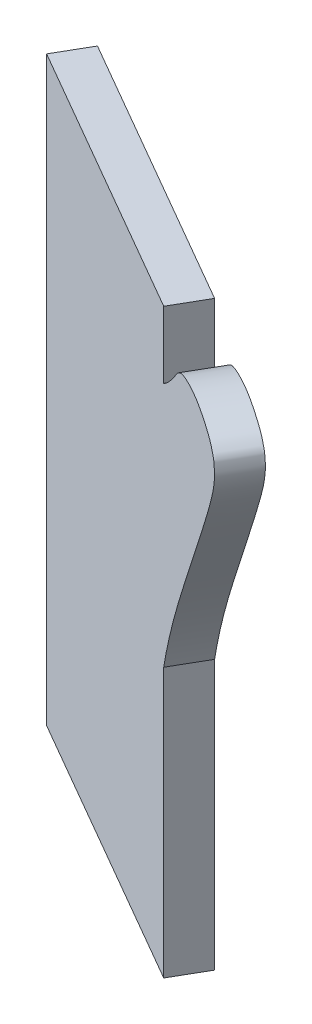
ISO-10303-21;
HEADER;
FILE_DESCRIPTION(('STEP AP214'),'2;1');
FILE_NAME('part.step','',(''),(''),'','','');
FILE_SCHEMA(('AUTOMOTIVE_DESIGN { 1 0 10303 214 1 1 1 1 }'));
ENDSEC;
DATA;
#1=APPLICATION_CONTEXT('core data for automotive mechanical design processes');
#2=APPLICATION_PROTOCOL_DEFINITION('international standard','automotive_design',2000,#1);
#3=PRODUCT_CONTEXT('',#1,'mechanical');
#4=PRODUCT('Part','Part','',(#3));
#5=PRODUCT_RELATED_PRODUCT_CATEGORY('part','',(#4));
#6=PRODUCT_DEFINITION_FORMATION('','',#4);
#7=PRODUCT_DEFINITION_CONTEXT('part definition',#1,'design');
#8=PRODUCT_DEFINITION('design','',#6,#7);
#9=PRODUCT_DEFINITION_SHAPE('','',#8);
#10=(LENGTH_UNIT() NAMED_UNIT(*) SI_UNIT(.MILLI.,.METRE.));
#11=(NAMED_UNIT(*) PLANE_ANGLE_UNIT() SI_UNIT($,.RADIAN.));
#12=(NAMED_UNIT(*) SI_UNIT($,.STERADIAN.) SOLID_ANGLE_UNIT());
#13=UNCERTAINTY_MEASURE_WITH_UNIT(LENGTH_MEASURE(1.E-05),#10,'distance_accuracy_value','');
#14=(GEOMETRIC_REPRESENTATION_CONTEXT(3) GLOBAL_UNCERTAINTY_ASSIGNED_CONTEXT((#13)) GLOBAL_UNIT_ASSIGNED_CONTEXT((#10,
#11,#12)) REPRESENTATION_CONTEXT('',''));
#15=CARTESIAN_POINT('',(0.,0.,0.));
#16=DIRECTION('',(0.,0.,1.));
#17=DIRECTION('',(1.,0.,0.));
#18=AXIS2_PLACEMENT_3D('',#15,#16,#17);
#19=CARTESIAN_POINT('',(7.80159971962486,1.25599999999999,13.9842601094867));
#20=DIRECTION('',(0.866024507379608,0.,0.500001552615496));
#21=DIRECTION('',(0.500001552615496,0.,-0.866024507379608));
#22=AXIS2_PLACEMENT_3D('',#19,#20,#21);
#23=PLANE('',#22);
#24=DIRECTION('',(0.,-1.,0.));
#25=VECTOR('',#24,1.);
#26=CARTESIAN_POINT('',(11.8016121405488,1.25599999999999,7.05606405044984));
#27=LINE('',#26,#25);
#28=CARTESIAN_POINT('',(11.8016121405488,1.25599999999999,7.05606405044984));
#29=VERTEX_POINT('',#28);
#30=CARTESIAN_POINT('',(11.8016121405488,-123.736,7.05606405044984));
#31=VERTEX_POINT('',#30);
#32=EDGE_CURVE('E151',#29,#31,#27,.T.);
#33=ORIENTED_EDGE('',*,*,#32,.T.);
#34=DIRECTION('',(0.500001552615496,0.,-0.866024507379608));
#35=VECTOR('',#34,1.);
#36=CARTESIAN_POINT('',(7.80159971962486,-123.736,13.9842601094867));
#37=LINE('',#36,#35);
#38=CARTESIAN_POINT('',(7.80159971962486,-123.736,13.9842601094867));
#39=VERTEX_POINT('',#38);
#40=EDGE_CURVE('E11',#39,#31,#37,.T.);
#41=ORIENTED_EDGE('',*,*,#40,.F.);
#42=DIRECTION('',(0.,-1.,0.));
#43=VECTOR('',#42,1.);
#44=CARTESIAN_POINT('',(7.80159971962486,1.25599999999999,13.9842601094867));
#45=LINE('',#44,#43);
#46=CARTESIAN_POINT('',(7.80159971962486,1.25599999999999,13.9842601094867));
#47=VERTEX_POINT('',#46);
#48=EDGE_CURVE('E158',#47,#39,#45,.T.);
#49=ORIENTED_EDGE('',*,*,#48,.F.);
#50=DIRECTION('',(0.500001552615496,0.,-0.866024507379608));
#51=VECTOR('',#50,1.);
#52=CARTESIAN_POINT('',(7.80159971962486,1.25599999999999,13.9842601094867));
#53=LINE('',#52,#51);
#54=EDGE_CURVE('E116',#47,#29,#53,.T.);
#55=ORIENTED_EDGE('',*,*,#54,.T.);
#56=EDGE_LOOP('',(#33,#41,#49,#55));
#57=FACE_BOUND('',#56,.T.);
#58=ADVANCED_FACE('F31',(#57),#23,.F.);
#59=CARTESIAN_POINT('',(7.80159971962486,-123.736,13.9842601094867));
#60=DIRECTION('',(0.,1.,0.));
#61=DIRECTION('',(-1.,0.,0.));
#62=AXIS2_PLACEMENT_3D('',#59,#60,#61);
#63=PLANE('',#62);
#64=DIRECTION('',(0.866024507379608,0.,0.500001552615496));
#65=VECTOR('',#64,1.);
#66=CARTESIAN_POINT('',(11.8016121405488,-123.736,7.05606405044984));
#67=LINE('',#66,#65);
#68=CARTESIAN_POINT('',(71.3416946420887,-123.736,41.4316890355929));
#69=VERTEX_POINT('',#68);
#70=EDGE_CURVE('E154',#31,#69,#67,.T.);
#71=ORIENTED_EDGE('',*,*,#70,.T.);
#72=DIRECTION('',(0.500001552615496,0.,-0.866024507379608));
#73=VECTOR('',#72,1.);
#74=CARTESIAN_POINT('',(67.3416822211648,-123.736,48.3598850946298));
#75=LINE('',#74,#73);
#76=CARTESIAN_POINT('',(67.3416822211648,-123.736,48.3598850946298));
#77=VERTEX_POINT('',#76);
#78=EDGE_CURVE('E40',#77,#69,#75,.T.);
#79=ORIENTED_EDGE('',*,*,#78,.F.);
#80=DIRECTION('',(0.866024507379608,0.,0.500001552615496));
#81=VECTOR('',#80,1.);
#82=CARTESIAN_POINT('',(7.80159971962486,-123.736,13.9842601094867));
#83=LINE('',#82,#81);
#84=EDGE_CURVE('E86',#39,#77,#83,.T.);
#85=ORIENTED_EDGE('',*,*,#84,.F.);
#86=ORIENTED_EDGE('',*,*,#40,.T.);
#87=EDGE_LOOP('',(#71,#79,#85,#86));
#88=FACE_BOUND('',#87,.T.);
#89=ADVANCED_FACE('F212',(#88),#63,.F.);
#90=CARTESIAN_POINT('',(67.3416822211648,-123.736,48.3598850946298));
#91=DIRECTION('',(-0.866024507379608,3.39362587450117E-08,-0.500001552615496));
#92=DIRECTION('',(-0.500001552615496,0.,0.866024507379608));
#93=AXIS2_PLACEMENT_3D('',#90,#91,#92);
#94=PLANE('',#93);
#95=DIRECTION('',(2.93896317663542E-08,0.999999999999999,1.69681820548487E-08));
#96=VECTOR('',#95,1.);
#97=CARTESIAN_POINT('',(71.3416946420887,-123.736,41.4316890355929));
#98=LINE('',#97,#96);
#99=CARTESIAN_POINT('',(71.3416963415527,-65.9107093126962,41.431690016783));
#100=VERTEX_POINT('',#99);
#101=EDGE_CURVE('E156',#69,#100,#98,.T.);
#102=ORIENTED_EDGE('',*,*,#101,.T.);
#103=DIRECTION('',(0.500001552615496,0.,-0.866024507379608));
#104=VECTOR('',#103,1.);
#105=CARTESIAN_POINT('',(67.3416839206288,-65.9107093126962,48.3598860758198));
#106=LINE('',#105,#104);
#107=CARTESIAN_POINT('',(67.3416839206288,-65.9107093126962,48.3598860758198));
#108=VERTEX_POINT('',#107);
#109=EDGE_CURVE('E111',#108,#100,#106,.T.);
#110=ORIENTED_EDGE('',*,*,#109,.F.);
#111=DIRECTION('',(2.93896317663542E-08,0.999999999999999,1.69681820548487E-08));
#112=VECTOR('',#111,1.);
#113=CARTESIAN_POINT('',(67.3416822211648,-123.736,48.3598850946298));
#114=LINE('',#113,#112);
#115=EDGE_CURVE('E100',#77,#108,#114,.T.);
#116=ORIENTED_EDGE('',*,*,#115,.F.);
#117=ORIENTED_EDGE('',*,*,#78,.T.);
#118=EDGE_LOOP('',(#102,#110,#116,#117));
#119=FACE_BOUND('',#118,.T.);
#120=ADVANCED_FACE('F138',(#119),#94,.F.);
#121=CARTESIAN_POINT('',(67.3416839206288,-65.9107093126962,48.3598860758198));
#122=CARTESIAN_POINT('',(67.4250185770641,-65.6443932058091,48.4079995613497));
#123=CARTESIAN_POINT('',(67.5930013691193,-65.1075634507249,48.5049848731101));
#124=CARTESIAN_POINT('',(68.1708084257599,-63.3446486646693,48.8385833139979));
#125=CARTESIAN_POINT('',(69.0687092921912,-60.8408831904544,49.3569887672903));
#126=CARTESIAN_POINT('',(70.4049351848799,-57.4996720191718,50.1284623402622));
#127=CARTESIAN_POINT('',(71.7722908958488,-54.3494689478632,50.9179087966111));
#128=CARTESIAN_POINT('',(73.7468338501138,-50.0914841697523,52.0579164227529));
#129=CARTESIAN_POINT('',(76.3406900276199,-44.9081403901387,53.5554861854592));
#130=CARTESIAN_POINT('',(79.6032484160417,-38.7227527052616,55.439132948119));
#131=CARTESIAN_POINT('',(82.9054747227887,-32.5646225699528,57.3456820889247));
#132=CARTESIAN_POINT('',(85.6331531518437,-27.4155860887233,58.9205144844765));
#133=CARTESIAN_POINT('',(87.7783477133897,-23.2713950006755,60.1590482699473));
#134=CARTESIAN_POINT('',(89.3640725882436,-20.1481312481985,61.0745707438401));
#135=CARTESIAN_POINT('',(90.6596388505885,-17.4971839357088,61.8225693710946));
#136=CARTESIAN_POINT('',(91.6227607580608,-15.3558219859797,62.378630365894));
#137=CARTESIAN_POINT('',(92.2327762733138,-13.8403301667215,62.7308244460234));
#138=CARTESIAN_POINT('',(92.6861510903478,-12.4956493595633,62.9925816024342));
#139=CARTESIAN_POINT('',(92.9799909643025,-11.3346937841033,63.1622308351588));
#140=CARTESIAN_POINT('',(93.1472288921861,-10.3048850458611,63.2587860976086));
#141=CARTESIAN_POINT('',(93.1767574542843,-9.50364877799679,63.2758344914702));
#142=CARTESIAN_POINT('',(93.099338936241,-8.90334587084222,63.2311367041756));
#143=CARTESIAN_POINT('',(93.0194461601597,-8.53695279525007,63.1850103974221));
#144=CARTESIAN_POINT('',(92.9521547733886,-8.24494472143904,63.1461595363016));
#145=CARTESIAN_POINT('',(92.9022617028213,-8.00556671763939,63.1173536393138));
#146=CARTESIAN_POINT('',(92.861606751814,-7.78392294364116,63.0938813952238));
#147=CARTESIAN_POINT('',(92.821224587063,-7.56252425341719,63.0705666450043));
#148=CARTESIAN_POINT('',(92.7736761661341,-7.3616213774872,63.0431144377212));
#149=CARTESIAN_POINT('',(92.6841931478094,-7.16973506613958,62.9914511791023));
#150=CARTESIAN_POINT('',(92.5609459431049,-6.99305015694481,62.9202940776777));
#151=CARTESIAN_POINT('',(92.4289127415344,-6.82989668869472,62.8440643575954));
#152=CARTESIAN_POINT('',(92.286451485307,-6.65951639169699,62.7618139724223));
#153=CARTESIAN_POINT('',(92.1063561300647,-6.44087695961502,62.6578354400913));
#154=CARTESIAN_POINT('',(91.8806633596306,-6.16200431540644,62.5275311188284));
#155=CARTESIAN_POINT('',(91.603066007306,-5.84578021388433,62.3672595491655));
#156=CARTESIAN_POINT('',(91.2107009328319,-5.45478272812354,62.1407265298833));
#157=CARTESIAN_POINT('',(90.6562440241383,-5.05964542940303,61.8206093590147));
#158=CARTESIAN_POINT('',(89.8628285366361,-4.63276079929274,61.3625288171365));
#159=CARTESIAN_POINT('',(88.9631492018624,-4.22884844091625,60.8430965604166));
#160=CARTESIAN_POINT('',(87.9646287430691,-3.86311614184569,60.266598117866));
#161=CARTESIAN_POINT('',(86.7896141220392,-3.49901543166738,59.588200301344));
#162=CARTESIAN_POINT('',(85.6753448724342,-3.23627398315193,58.9448739865727));
#163=CARTESIAN_POINT('',(84.6361602906522,-3.06784078423496,58.3448980044642));
#164=CARTESIAN_POINT('',(83.5581799598572,-2.95341185270874,57.7225231934818));
#165=CARTESIAN_POINT('',(82.255408457793,-2.92646183222258,56.9703646019123));
#166=CARTESIAN_POINT('',(80.9492033596063,-3.02361839806387,56.2162236144895));
#167=CARTESIAN_POINT('',(79.947686559553,-3.15675661393056,55.6379952263434));
#168=CARTESIAN_POINT('',(78.9122753248351,-3.33477455561767,55.040197796198));
#169=CARTESIAN_POINT('',(77.6349541026097,-3.64300936505477,54.302732991381));
#170=CARTESIAN_POINT('',(76.3894206975528,-4.13816621110862,53.5836209673491));
#171=CARTESIAN_POINT('',(75.4606675905917,-4.70415442173628,53.0474028909322));
#172=CARTESIAN_POINT('',(74.8296478849115,-5.20222536260989,52.6830819855969));
#173=CARTESIAN_POINT('',(74.2326709109082,-5.79250657234663,52.3384157419354));
#174=CARTESIAN_POINT('',(73.673761500571,-6.44161133721655,52.0157279074011));
#175=CARTESIAN_POINT('',(73.1235388282237,-7.12856422146465,51.6980553841485));
#176=CARTESIAN_POINT('',(72.5914592282921,-7.80596002972506,51.3908578120084));
#177=CARTESIAN_POINT('',(72.0567614718499,-8.46084917577872,51.0821486402436));
#178=CARTESIAN_POINT('',(71.4971852512627,-9.1030202703917,50.759075821038));
#179=CARTESIAN_POINT('',(70.9273613801703,-9.72198907594131,50.4300864935585));
#180=CARTESIAN_POINT('',(70.257241151196,-10.4213595014653,50.0431907971076));
#181=CARTESIAN_POINT('',(69.5146097098706,-11.1801392578159,49.6144305593548));
#182=CARTESIAN_POINT('',(68.7133019812115,-11.9639640397113,49.1517934110545));
#183=CARTESIAN_POINT('',(68.0861463176923,-12.5210407618445,48.7897034207376));
#184=CARTESIAN_POINT('',(67.6334596188166,-12.8859201050998,48.5283435511756));
#185=CARTESIAN_POINT('',(67.4374560317178,-13.0310331619142,48.4151803588727));
#186=CARTESIAN_POINT('',(67.3416875676674,-13.1019362243044,48.3598881814473));
#187=B_SPLINE_CURVE_WITH_KNOTS('',3,(#121,#122,#123,#124,#125,#126,#127,#128,#129,#130,#131,
#132,#133,#134,#135,#136,#137,#138,#139,#140,#141,#142,#143,#144,#145,#146,#147,#148,#149,#150,
#151,#152,#153,#154,#155,#156,#157,#158,#159,#160,#161,#162,#163,#164,#165,#166,#167,#168,#169,
#170,#171,#172,#173,#174,#175,#176,#177,#178,#179,#180,#181,#182,#183,#184,#185,#186),
.UNSPECIFIED.,.F.,.F.,(4,1,1,1,1,1,1,1,1,1,1,1,1,1,1,1,1,1,1,1,1,1,1,1,1,1,1,1,1,1,1,1,1,1,1,1,
1,1,1,1,1,1,1,1,1,1,1,1,1,1,1,1,1,1,1,1,1,1,1,1,1,1,1,4),(0.,0.00846395270668072,
0.0170613100036752,0.0563409393885795,0.0894306469746048,0.127049859231679,0.161649614022442,
0.233790115023729,0.305949986364783,0.378125216084441,0.450290764715002,0.48636628203248,
0.522437019024613,0.558508325160238,0.577335814863162,0.594548582324667,0.608436615105018,
0.620429298275849,0.630644391600651,0.639710377160591,0.644223336771775,0.648737938560021,
0.650998137724496,0.653255776350552,0.656096666903942,0.657768340696525,0.660022780399808,
0.662294932511886,0.664220421075068,0.666791311788226,0.668968246528383,0.671299639599866,
0.675810579785096,0.680376354878968,0.684753579322347,0.69367276896837,0.702739505244248,
0.714950414307387,0.726959607427126,0.738878876905496,0.756929844475176,0.7661665285936,
0.775086596144317,0.794280431772057,0.811063130830267,0.820227717574875,0.829069907433601,
0.847188678488973,0.865210378184002,0.874299206516504,0.883362715093664,0.891530190432093,
0.901389170400294,0.910705234717654,0.919499400290552,0.928724569823576,0.93760455113099,
0.946724774750474,0.955723962195746,0.968779936663822,0.980949589620896,0.991964519463167,
0.996073818646335,1.),.UNSPECIFIED.);
#188=DIRECTION('',(0.500001552615496,0.,-0.866024507379608));
#189=VECTOR('',#188,1.);
#190=SURFACE_OF_LINEAR_EXTRUSION('',#187,#189);
#191=CARTESIAN_POINT('',(71.3416963415527,-65.9107093126962,41.4316900167831));
#192=CARTESIAN_POINT('',(71.425030997988,-65.6443932058091,41.4798035023129));
#193=CARTESIAN_POINT('',(71.5930137900433,-65.1075634507249,41.5767888140733));
#194=CARTESIAN_POINT('',(72.1708208466838,-63.3446486646693,41.9103872549611));
#195=CARTESIAN_POINT('',(73.0687217131151,-60.8408831904544,42.4287927082535));
#196=CARTESIAN_POINT('',(74.4049476058038,-57.4996720191718,43.2002662812254));
#197=CARTESIAN_POINT('',(75.7723033167727,-54.3494689478632,43.9897127375743));
#198=CARTESIAN_POINT('',(77.7468462710377,-50.0914841697523,45.1297203637161));
#199=CARTESIAN_POINT('',(80.3407024485438,-44.9081403901387,46.6272901264225));
#200=CARTESIAN_POINT('',(83.6032608369656,-38.7227527052616,48.5109368890822));
#201=CARTESIAN_POINT('',(86.9054871437127,-32.5646225699528,50.4174860298879));
#202=CARTESIAN_POINT('',(89.6331655727676,-27.4155860887233,51.9923184254398));
#203=CARTESIAN_POINT('',(91.7783601343136,-23.2713950006755,53.2308522109106));
#204=CARTESIAN_POINT('',(93.3640850091675,-20.1481312481985,54.1463746848034));
#205=CARTESIAN_POINT('',(94.6596512715124,-17.4971839357088,54.8943733120578));
#206=CARTESIAN_POINT('',(95.6227731789847,-15.3558219859797,55.4504343068572));
#207=CARTESIAN_POINT('',(96.2327886942377,-13.8403301667215,55.8026283869866));
#208=CARTESIAN_POINT('',(96.6861635112717,-12.4956493595633,56.0643855433974));
#209=CARTESIAN_POINT('',(96.9800033852264,-11.3346937841033,56.234034776122));
#210=CARTESIAN_POINT('',(97.14724131311,-10.3048850458611,56.3305900385718));
#211=CARTESIAN_POINT('',(97.1767698752082,-9.50364877799679,56.3476384324335));
#212=CARTESIAN_POINT('',(97.099351357165,-8.90334587084222,56.3029406451388));
#213=CARTESIAN_POINT('',(97.0194585810836,-8.53695279525007,56.2568143383853));
#214=CARTESIAN_POINT('',(96.9521671943126,-8.24494472143904,56.2179634772648));
#215=CARTESIAN_POINT('',(96.9022741237453,-8.00556671763939,56.1891575802771));
#216=CARTESIAN_POINT('',(96.8616191727379,-7.78392294364116,56.165685336187));
#217=CARTESIAN_POINT('',(96.8212370079869,-7.56252425341719,56.1423705859676));
#218=CARTESIAN_POINT('',(96.773688587058,-7.3616213774872,56.1149183786844));
#219=CARTESIAN_POINT('',(96.6842055687333,-7.16973506613958,56.0632551200655));
#220=CARTESIAN_POINT('',(96.5609583640288,-6.99305015694481,55.9920980186409));
#221=CARTESIAN_POINT('',(96.4289251624584,-6.82989668869472,55.9158682985586));
#222=CARTESIAN_POINT('',(96.2864639062309,-6.65951639169699,55.8336179133855));
#223=CARTESIAN_POINT('',(96.1063685509886,-6.44087695961502,55.7296393810545));
#224=CARTESIAN_POINT('',(95.8806757805545,-6.16200431540644,55.5993350597917));
#225=CARTESIAN_POINT('',(95.6030784282299,-5.84578021388433,55.4390634901287));
#226=CARTESIAN_POINT('',(95.2107133537558,-5.45478272812354,55.2125304708465));
#227=CARTESIAN_POINT('',(94.6562564450622,-5.05964542940303,54.892413299978));
#228=CARTESIAN_POINT('',(93.8628409575601,-4.63276079929274,54.4343327580997));
#229=CARTESIAN_POINT('',(92.9631616227863,-4.22884844091625,53.9149005013798));
#230=CARTESIAN_POINT('',(91.9646411639931,-3.86311614184569,53.3384020588292));
#231=CARTESIAN_POINT('',(90.7896265429631,-3.49901543166738,52.6600042423072));
#232=CARTESIAN_POINT('',(89.6753572933581,-3.23627398315193,52.0166779275359));
#233=CARTESIAN_POINT('',(88.6361727115761,-3.06784078423496,51.4167019454274));
#234=CARTESIAN_POINT('',(87.5581923807811,-2.95341185270874,50.794327134445));
#235=CARTESIAN_POINT('',(86.2554208787169,-2.92646183222258,50.0421685428755));
#236=CARTESIAN_POINT('',(84.9492157805302,-3.02361839806387,49.2880275554527));
#237=CARTESIAN_POINT('',(83.9476989804769,-3.15675661393056,48.7097991673066));
#238=CARTESIAN_POINT('',(82.912287745759,-3.33477455561767,48.1120017371612));
#239=CARTESIAN_POINT('',(81.6349665235336,-3.64300936505477,47.3745369323442));
#240=CARTESIAN_POINT('',(80.3894331184767,-4.13816621110862,46.6554249083124));
#241=CARTESIAN_POINT('',(79.4606800115156,-4.70415442173628,46.1192068318954));
#242=CARTESIAN_POINT('',(78.8296603058354,-5.20222536260989,45.7548859265601));
#243=CARTESIAN_POINT('',(78.2326833318321,-5.79250657234663,45.4102196828986));
#244=CARTESIAN_POINT('',(77.6737739214949,-6.44161133721655,45.0875318483643));
#245=CARTESIAN_POINT('',(77.1235512491477,-7.12856422146465,44.7698593251117));
#246=CARTESIAN_POINT('',(76.591471649216,-7.80596002972506,44.4626617529716));
#247=CARTESIAN_POINT('',(76.0567738927738,-8.46084917577872,44.1539525812068));
#248=CARTESIAN_POINT('',(75.4971976721866,-9.1030202703917,43.8308797620012));
#249=CARTESIAN_POINT('',(74.9273738010942,-9.72198907594131,43.5018904345217));
#250=CARTESIAN_POINT('',(74.25725357212,-10.4213595014653,43.1149947380708));
#251=CARTESIAN_POINT('',(73.5146221307945,-11.1801392578159,42.686234500318));
#252=CARTESIAN_POINT('',(72.7133144021355,-11.9639640397113,42.2235973520177));
#253=CARTESIAN_POINT('',(72.0861587386162,-12.5210407618445,41.8615073617008));
#254=CARTESIAN_POINT('',(71.6334720397406,-12.8859201050998,41.6001474921389));
#255=CARTESIAN_POINT('',(71.4374684526417,-13.0310331619142,41.4869842998359));
#256=CARTESIAN_POINT('',(71.3416999885914,-13.1019362243044,41.4316921224106));
#257=B_SPLINE_CURVE_WITH_KNOTS('',3,(#191,#192,#193,#194,#195,#196,#197,#198,#199,#200,#201,
#202,#203,#204,#205,#206,#207,#208,#209,#210,#211,#212,#213,#214,#215,#216,#217,#218,#219,#220,
#221,#222,#223,#224,#225,#226,#227,#228,#229,#230,#231,#232,#233,#234,#235,#236,#237,#238,#239,
#240,#241,#242,#243,#244,#245,#246,#247,#248,#249,#250,#251,#252,#253,#254,#255,#256),
.UNSPECIFIED.,.F.,.F.,(4,1,1,1,1,1,1,1,1,1,1,1,1,1,1,1,1,1,1,1,1,1,1,1,1,1,1,1,1,1,1,1,1,1,1,1,
1,1,1,1,1,1,1,1,1,1,1,1,1,1,1,1,1,1,1,1,1,1,1,1,1,1,1,4),(0.,0.00846395270668072,
0.0170613100036752,0.0563409393885795,0.0894306469746048,0.127049859231679,0.161649614022442,
0.233790115023729,0.305949986364783,0.378125216084441,0.450290764715002,0.48636628203248,
0.522437019024613,0.558508325160238,0.577335814863162,0.594548582324667,0.608436615105018,
0.620429298275849,0.630644391600651,0.639710377160591,0.644223336771775,0.648737938560021,
0.650998137724496,0.653255776350552,0.656096666903942,0.657768340696525,0.660022780399808,
0.662294932511886,0.664220421075068,0.666791311788226,0.668968246528383,0.671299639599866,
0.675810579785096,0.680376354878968,0.684753579322347,0.69367276896837,0.702739505244248,
0.714950414307387,0.726959607427126,0.738878876905496,0.756929844475176,0.7661665285936,
0.775086596144317,0.794280431772057,0.811063130830267,0.820227717574875,0.829069907433601,
0.847188678488973,0.865210378184002,0.874299206516504,0.883362715093664,0.891530190432093,
0.901389170400294,0.910705234717654,0.919499400290552,0.928724569823576,0.93760455113099,
0.946724774750474,0.955723962195746,0.968779936663822,0.980949589620896,0.991964519463167,
0.996073818646335,1.),.UNSPECIFIED.);
#258=CARTESIAN_POINT('',(71.3416999885914,-13.1019362243044,41.4316921224105));
#259=VERTEX_POINT('',#258);
#260=EDGE_CURVE('E109',#100,#259,#257,.T.);
#261=ORIENTED_EDGE('',*,*,#260,.T.);
#262=DIRECTION('',(0.500001552615496,0.,-0.866024507379608));
#263=VECTOR('',#262,1.);
#264=CARTESIAN_POINT('',(67.3416875676674,-13.1019362243044,48.3598881814473));
#265=LINE('',#264,#263);
#266=CARTESIAN_POINT('',(67.3416875676674,-13.1019362243044,48.3598881814473));
#267=VERTEX_POINT('',#266);
#268=EDGE_CURVE('E106',#267,#259,#265,.T.);
#269=ORIENTED_EDGE('',*,*,#268,.F.);
#270=CARTESIAN_POINT('',(67.3416875676674,-13.1019362243044,48.3598881814473));
#271=CARTESIAN_POINT('',(67.4374560317178,-13.0310331619142,48.4151803588727));
#272=CARTESIAN_POINT('',(67.6334596188166,-12.8859201050998,48.5283435511756));
#273=CARTESIAN_POINT('',(68.0861463176923,-12.5210407618445,48.7897034207376));
#274=CARTESIAN_POINT('',(68.7133019812115,-11.9639640397113,49.1517934110545));
#275=CARTESIAN_POINT('',(69.5146097098706,-11.1801392578159,49.6144305593548));
#276=CARTESIAN_POINT('',(70.257241151196,-10.4213595014653,50.0431907971076));
#277=CARTESIAN_POINT('',(70.9273613801703,-9.72198907594131,50.4300864935585));
#278=CARTESIAN_POINT('',(71.4971852512627,-9.1030202703917,50.759075821038));
#279=CARTESIAN_POINT('',(72.0567614718499,-8.46084917577872,51.0821486402436));
#280=CARTESIAN_POINT('',(72.5914592282921,-7.80596002972506,51.3908578120084));
#281=CARTESIAN_POINT('',(73.1235388282237,-7.12856422146465,51.6980553841485));
#282=CARTESIAN_POINT('',(73.673761500571,-6.44161133721655,52.0157279074011));
#283=CARTESIAN_POINT('',(74.2326709109082,-5.79250657234663,52.3384157419354));
#284=CARTESIAN_POINT('',(74.8296478849115,-5.20222536260989,52.6830819855969));
#285=CARTESIAN_POINT('',(75.4606675905917,-4.70415442173628,53.0474028909322));
#286=CARTESIAN_POINT('',(76.3894206975528,-4.13816621110862,53.5836209673491));
#287=CARTESIAN_POINT('',(77.6349541026097,-3.64300936505477,54.302732991381));
#288=CARTESIAN_POINT('',(78.9122753248351,-3.33477455561767,55.040197796198));
#289=CARTESIAN_POINT('',(79.947686559553,-3.15675661393056,55.6379952263434));
#290=CARTESIAN_POINT('',(80.9492033596063,-3.02361839806387,56.2162236144895));
#291=CARTESIAN_POINT('',(82.255408457793,-2.92646183222258,56.9703646019123));
#292=CARTESIAN_POINT('',(83.5581799598572,-2.95341185270874,57.7225231934818));
#293=CARTESIAN_POINT('',(84.6361602906522,-3.06784078423496,58.3448980044642));
#294=CARTESIAN_POINT('',(85.6753448724342,-3.23627398315193,58.9448739865727));
#295=CARTESIAN_POINT('',(86.7896141220392,-3.49901543166738,59.588200301344));
#296=CARTESIAN_POINT('',(87.9646287430691,-3.86311614184569,60.266598117866));
#297=CARTESIAN_POINT('',(88.9631492018624,-4.22884844091625,60.8430965604166));
#298=CARTESIAN_POINT('',(89.8628285366361,-4.63276079929274,61.3625288171365));
#299=CARTESIAN_POINT('',(90.6562440241383,-5.05964542940303,61.8206093590147));
#300=CARTESIAN_POINT('',(91.2107009328319,-5.45478272812354,62.1407265298833));
#301=CARTESIAN_POINT('',(91.603066007306,-5.84578021388433,62.3672595491655));
#302=CARTESIAN_POINT('',(91.8806633596306,-6.16200431540644,62.5275311188284));
#303=CARTESIAN_POINT('',(92.1063561300647,-6.44087695961502,62.6578354400913));
#304=CARTESIAN_POINT('',(92.286451485307,-6.65951639169699,62.7618139724223));
#305=CARTESIAN_POINT('',(92.4289127415344,-6.82989668869472,62.8440643575954));
#306=CARTESIAN_POINT('',(92.5609459431049,-6.99305015694481,62.9202940776777));
#307=CARTESIAN_POINT('',(92.6841931478094,-7.16973506613958,62.9914511791023));
#308=CARTESIAN_POINT('',(92.7736761661341,-7.3616213774872,63.0431144377212));
#309=CARTESIAN_POINT('',(92.821224587063,-7.56252425341719,63.0705666450043));
#310=CARTESIAN_POINT('',(92.861606751814,-7.78392294364116,63.0938813952238));
#311=CARTESIAN_POINT('',(92.9022617028213,-8.00556671763939,63.1173536393138));
#312=CARTESIAN_POINT('',(92.9521547733886,-8.24494472143904,63.1461595363016));
#313=CARTESIAN_POINT('',(93.0194461601597,-8.53695279525007,63.1850103974221));
#314=CARTESIAN_POINT('',(93.099338936241,-8.90334587084222,63.2311367041756));
#315=CARTESIAN_POINT('',(93.1767574542843,-9.50364877799679,63.2758344914702));
#316=CARTESIAN_POINT('',(93.1472288921861,-10.3048850458611,63.2587860976086));
#317=CARTESIAN_POINT('',(92.9799909643025,-11.3346937841033,63.1622308351588));
#318=CARTESIAN_POINT('',(92.6861510903478,-12.4956493595633,62.9925816024342));
#319=CARTESIAN_POINT('',(92.2327762733138,-13.8403301667215,62.7308244460234));
#320=CARTESIAN_POINT('',(91.6227607580608,-15.3558219859797,62.378630365894));
#321=CARTESIAN_POINT('',(90.6596388505885,-17.4971839357088,61.8225693710946));
#322=CARTESIAN_POINT('',(89.3640725882436,-20.1481312481985,61.0745707438401));
#323=CARTESIAN_POINT('',(87.7783477133897,-23.2713950006755,60.1590482699473));
#324=CARTESIAN_POINT('',(85.6331531518437,-27.4155860887233,58.9205144844765));
#325=CARTESIAN_POINT('',(82.9054747227887,-32.5646225699528,57.3456820889247));
#326=CARTESIAN_POINT('',(79.6032484160417,-38.7227527052616,55.439132948119));
#327=CARTESIAN_POINT('',(76.3406900276199,-44.9081403901387,53.5554861854592));
#328=CARTESIAN_POINT('',(73.7468338501138,-50.0914841697523,52.0579164227529));
#329=CARTESIAN_POINT('',(71.7722908958488,-54.3494689478632,50.9179087966111));
#330=CARTESIAN_POINT('',(70.4049351848799,-57.4996720191718,50.1284623402622));
#331=CARTESIAN_POINT('',(69.0687092921912,-60.8408831904544,49.3569887672903));
#332=CARTESIAN_POINT('',(68.1708084257599,-63.3446486646693,48.8385833139979));
#333=CARTESIAN_POINT('',(67.5930013691193,-65.1075634507249,48.5049848731101));
#334=CARTESIAN_POINT('',(67.4250185770641,-65.6443932058091,48.4079995613497));
#335=CARTESIAN_POINT('',(67.3416839206288,-65.9107093126962,48.3598860758198));
#336=B_SPLINE_CURVE_WITH_KNOTS('',3,(#270,#271,#272,#273,#274,#275,#276,#277,#278,#279,#280,
#281,#282,#283,#284,#285,#286,#287,#288,#289,#290,#291,#292,#293,#294,#295,#296,#297,#298,#299,
#300,#301,#302,#303,#304,#305,#306,#307,#308,#309,#310,#311,#312,#313,#314,#315,#316,#317,#318,
#319,#320,#321,#322,#323,#324,#325,#326,#327,#328,#329,#330,#331,#332,#333,#334,#335),
.UNSPECIFIED.,.F.,.F.,(4,1,1,1,1,1,1,1,1,1,1,1,1,1,1,1,1,1,1,1,1,1,1,1,1,1,1,1,1,1,1,1,1,1,1,1,
1,1,1,1,1,1,1,1,1,1,1,1,1,1,1,1,1,1,1,1,1,1,1,1,1,1,1,4),(0.,0.00392618135366485,
0.00803548053683312,0.0190504103791045,0.0312200633361777,0.0442760378042545,0.0532752252495261,
0.0623954488690101,0.0712754301764237,0.0805005997094482,0.0892947652823458,0.0986108295997058,
0.108469809567907,0.116637284906336,0.125700793483496,0.134789621815998,0.152811321511027,
0.170930092566399,0.179772282425125,0.188936869169733,0.205719568227943,0.224913403855683,
0.2338334714064,0.243070155524824,0.261121123094504,0.273040392572874,0.285049585692613,
0.297260494755752,0.30632723103163,0.315246420677653,0.319623645121032,0.324189420214904,
0.328700360400134,0.331031753471617,0.333208688211774,0.335779578924932,0.337705067488114,
0.339977219600192,0.342231659303475,0.343903333096058,0.346744223649448,0.349001862275504,
0.351262061439979,0.355776663228225,0.360289622839409,0.369355608399349,0.379570701724151,
0.391563384894982,0.405451417675333,0.422664185136838,0.441491674839762,0.477562980975387,
0.51363371796752,0.549709235284998,0.621874783915559,0.694050013635217,0.766209884976271,
0.838350385977558,0.872950140768321,0.910569353025395,0.94365906061142,0.982938689996325,
0.991536047293319,1.),.UNSPECIFIED.);
#337=EDGE_CURVE('E93',#108,#267,#336,.F.);
#338=ORIENTED_EDGE('',*,*,#337,.F.);
#339=ORIENTED_EDGE('',*,*,#109,.T.);
#340=EDGE_LOOP('',(#261,#269,#338,#339));
#341=FACE_BOUND('',#340,.T.);
#342=ADVANCED_FACE('F107',(#341),#190,.F.);
#343=CARTESIAN_POINT('',(67.341682240398,1.25599999999986,48.3598851057342));
#344=DIRECTION('',(-0.866024507379529,-4.28432550518932E-07,-0.50000155261545));
#345=DIRECTION('',(-0.500001552615496,0.,0.866024507379608));
#346=AXIS2_PLACEMENT_3D('',#343,#344,#345);
#347=PLANE('',#346);
#348=DIRECTION('',(-3.71033088184882E-07,0.999999999999908,-2.14216941011086E-07));
#349=VECTOR('',#348,1.);
#350=CARTESIAN_POINT('',(71.341694661322,1.25599999999986,41.4316890466973));
#351=LINE('',#350,#349);
#352=CARTESIAN_POINT('',(71.341694661322,1.25599999999986,41.4316890466973));
#353=VERTEX_POINT('',#352);
#354=EDGE_CURVE('E72',#259,#353,#351,.T.);
#355=ORIENTED_EDGE('',*,*,#354,.T.);
#356=DIRECTION('',(0.500001552615496,0.,-0.866024507379608));
#357=VECTOR('',#356,1.);
#358=CARTESIAN_POINT('',(67.341682240398,1.25599999999986,48.3598851057342));
#359=LINE('',#358,#357);
#360=CARTESIAN_POINT('',(67.341682240398,1.25599999999986,48.3598851057342));
#361=VERTEX_POINT('',#360);
#362=EDGE_CURVE('E112',#361,#353,#359,.T.);
#363=ORIENTED_EDGE('',*,*,#362,.F.);
#364=DIRECTION('',(-3.71033088184882E-07,0.999999999999908,-2.14216941011086E-07));
#365=VECTOR('',#364,1.);
#366=CARTESIAN_POINT('',(67.341682240398,1.25599999999986,48.3598851057342));
#367=LINE('',#366,#365);
#368=EDGE_CURVE('E98',#267,#361,#367,.T.);
#369=ORIENTED_EDGE('',*,*,#368,.F.);
#370=ORIENTED_EDGE('',*,*,#268,.T.);
#371=EDGE_LOOP('',(#355,#363,#369,#370));
#372=FACE_BOUND('',#371,.T.);
#373=ADVANCED_FACE('F114',(#372),#347,.F.);
#374=CARTESIAN_POINT('',(67.341682240398,1.25599999999986,48.3598851057342));
#375=DIRECTION('',(0.,-1.,0.));
#376=DIRECTION('',(1.,0.,0.));
#377=AXIS2_PLACEMENT_3D('',#374,#375,#376);
#378=PLANE('',#377);
#379=DIRECTION('',(-0.866024507379608,0.,-0.500001552615496));
#380=VECTOR('',#379,1.);
#381=CARTESIAN_POINT('',(71.341694661322,1.25599999999986,41.4316890466973));
#382=LINE('',#381,#380);
#383=EDGE_CURVE('E78',#353,#29,#382,.T.);
#384=ORIENTED_EDGE('',*,*,#383,.T.);
#385=ORIENTED_EDGE('',*,*,#54,.F.);
#386=DIRECTION('',(-0.866024507379608,0.,-0.500001552615496));
#387=VECTOR('',#386,1.);
#388=CARTESIAN_POINT('',(67.341682240398,1.25599999999986,48.3598851057342));
#389=LINE('',#388,#387);
#390=EDGE_CURVE('E49',#361,#47,#389,.T.);
#391=ORIENTED_EDGE('',*,*,#390,.F.);
#392=ORIENTED_EDGE('',*,*,#362,.T.);
#393=EDGE_LOOP('',(#384,#385,#391,#392));
#394=FACE_BOUND('',#393,.T.);
#395=ADVANCED_FACE('F189',(#394),#378,.F.);
#396=CARTESIAN_POINT('',(88.3764270309674,-22.0899120965818,60.5043509546033));
#397=DIRECTION('',(-0.500001552615869,1.60273121435507E-13,0.866024507379393));
#398=DIRECTION('',(0.866024507379393,0.,0.500001552615869));
#399=AXIS2_PLACEMENT_3D('',#396,#397,#398);
#400=PLANE('',#399);
#401=ORIENTED_EDGE('',*,*,#48,.T.);
#402=ORIENTED_EDGE('',*,*,#84,.T.);
#403=ORIENTED_EDGE('',*,*,#115,.T.);
#404=ORIENTED_EDGE('',*,*,#337,.T.);
#405=ORIENTED_EDGE('',*,*,#368,.T.);
#406=ORIENTED_EDGE('',*,*,#390,.T.);
#407=EDGE_LOOP('',(#401,#402,#403,#404,#405,#406));
#408=FACE_BOUND('',#407,.T.);
#409=ADVANCED_FACE('F96',(#408),#400,.T.);
#410=CARTESIAN_POINT('',(92.3764394518913,-22.0899120965818,53.5761548955664));
#411=DIRECTION('',(-0.500001552615869,1.60273121435507E-13,0.866024507379393));
#412=DIRECTION('',(0.866024507379393,0.,0.500001552615869));
#413=AXIS2_PLACEMENT_3D('',#410,#411,#412);
#414=PLANE('',#413);
#415=ORIENTED_EDGE('',*,*,#32,.F.);
#416=ORIENTED_EDGE('',*,*,#383,.F.);
#417=ORIENTED_EDGE('',*,*,#354,.F.);
#418=ORIENTED_EDGE('',*,*,#260,.F.);
#419=ORIENTED_EDGE('',*,*,#101,.F.);
#420=ORIENTED_EDGE('',*,*,#70,.F.);
#421=EDGE_LOOP('',(#415,#416,#417,#418,#419,#420));
#422=FACE_BOUND('',#421,.T.);
#423=ADVANCED_FACE('F188',(#422),#414,.F.);
#424=CLOSED_SHELL('',(#58,#89,#120,#342,#373,#395,#409,#423));
#425=MANIFOLD_SOLID_BREP('B2',#424);
#426=ADVANCED_BREP_SHAPE_REPRESENTATION('',(#18,#425),#14);
#427=SHAPE_DEFINITION_REPRESENTATION(#9,#426);
ENDSEC;
END-ISO-10303-21;
